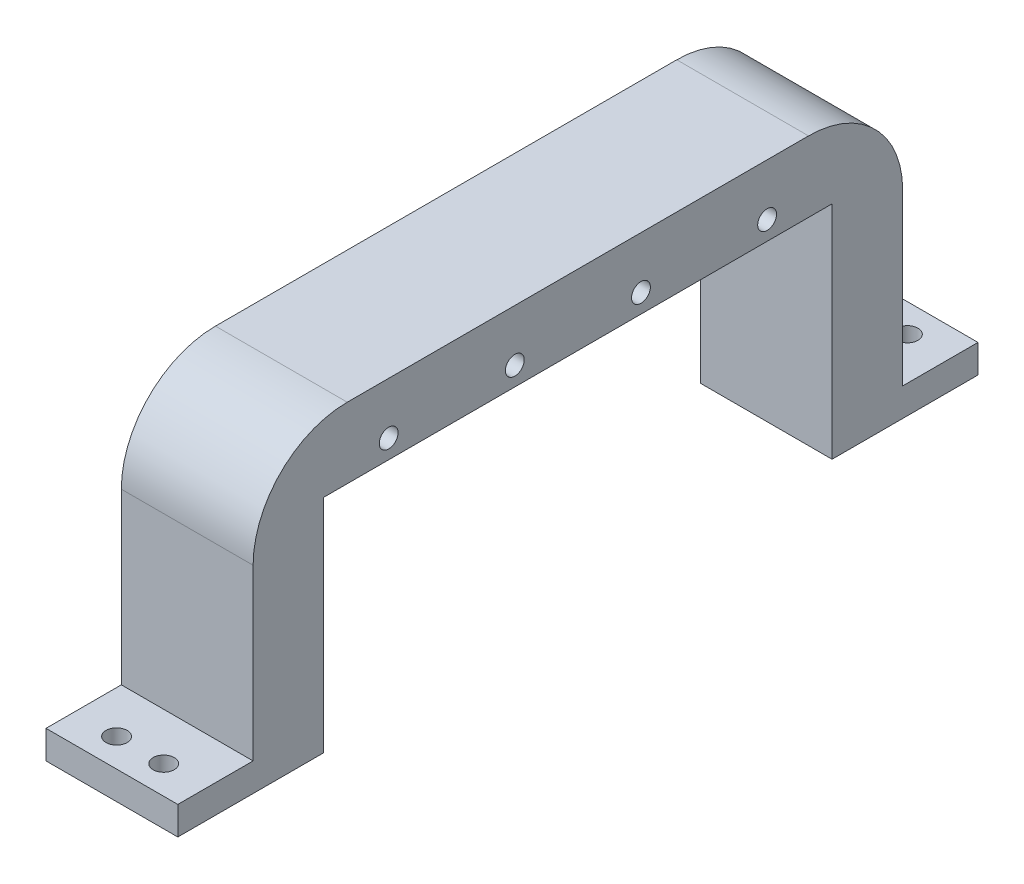
ISO-10303-21;
HEADER;
FILE_DESCRIPTION(('STEP AP214'),'2;1');
FILE_NAME('part.step','',(''),(''),'','','');
FILE_SCHEMA(('AUTOMOTIVE_DESIGN { 1 0 10303 214 1 1 1 1 }'));
ENDSEC;
DATA;
#1=APPLICATION_CONTEXT('core data for automotive mechanical design processes');
#2=APPLICATION_PROTOCOL_DEFINITION('international standard','automotive_design',2000,#1);
#3=PRODUCT_CONTEXT('',#1,'mechanical');
#4=PRODUCT('Part','Part','',(#3));
#5=PRODUCT_RELATED_PRODUCT_CATEGORY('part','',(#4));
#6=PRODUCT_DEFINITION_FORMATION('','',#4);
#7=PRODUCT_DEFINITION_CONTEXT('part definition',#1,'design');
#8=PRODUCT_DEFINITION('design','',#6,#7);
#9=PRODUCT_DEFINITION_SHAPE('','',#8);
#10=(LENGTH_UNIT() NAMED_UNIT(*) SI_UNIT(.MILLI.,.METRE.));
#11=(NAMED_UNIT(*) PLANE_ANGLE_UNIT() SI_UNIT($,.RADIAN.));
#12=(NAMED_UNIT(*) SI_UNIT($,.STERADIAN.) SOLID_ANGLE_UNIT());
#13=UNCERTAINTY_MEASURE_WITH_UNIT(LENGTH_MEASURE(1.E-05),#10,'distance_accuracy_value','');
#14=(GEOMETRIC_REPRESENTATION_CONTEXT(3) GLOBAL_UNCERTAINTY_ASSIGNED_CONTEXT((#13)) GLOBAL_UNIT_ASSIGNED_CONTEXT((#10,
#11,#12)) REPRESENTATION_CONTEXT('',''));
#15=CARTESIAN_POINT('',(0.,0.,0.));
#16=DIRECTION('',(0.,0.,1.));
#17=DIRECTION('',(1.,0.,0.));
#18=AXIS2_PLACEMENT_3D('',#15,#16,#17);
#19=CARTESIAN_POINT('',(-7.,0.,-27.));
#20=DIRECTION('',(0.,0.,1.));
#21=DIRECTION('',(0.,-1.,0.));
#22=AXIS2_PLACEMENT_3D('',#19,#20,#21);
#23=PLANE('',#22);
#24=DIRECTION('',(1.,0.,0.));
#25=VECTOR('',#24,1.);
#26=CARTESIAN_POINT('',(-7.,-23.5,-27.));
#27=LINE('',#26,#25);
#28=CARTESIAN_POINT('',(-7.,-23.5,-27.));
#29=VERTEX_POINT('',#28);
#30=CARTESIAN_POINT('',(7.,-23.5,-27.));
#31=VERTEX_POINT('',#30);
#32=EDGE_CURVE('E191',#29,#31,#27,.T.);
#33=ORIENTED_EDGE('',*,*,#32,.T.);
#34=DIRECTION('',(0.,-1.,0.));
#35=VECTOR('',#34,1.);
#36=CARTESIAN_POINT('',(7.,0.,-27.));
#37=LINE('',#36,#35);
#38=CARTESIAN_POINT('',(7.,0.,-27.));
#39=VERTEX_POINT('',#38);
#40=EDGE_CURVE('E364',#39,#31,#37,.T.);
#41=ORIENTED_EDGE('',*,*,#40,.F.);
#42=DIRECTION('',(1.,0.,0.));
#43=VECTOR('',#42,1.);
#44=CARTESIAN_POINT('',(-7.,0.,-27.));
#45=LINE('',#44,#43);
#46=CARTESIAN_POINT('',(-7.,0.,-27.));
#47=VERTEX_POINT('',#46);
#48=EDGE_CURVE('E192',#47,#39,#45,.T.);
#49=ORIENTED_EDGE('',*,*,#48,.F.);
#50=DIRECTION('',(0.,-1.,0.));
#51=VECTOR('',#50,1.);
#52=CARTESIAN_POINT('',(-7.,0.,-27.));
#53=LINE('',#52,#51);
#54=EDGE_CURVE('E172',#47,#29,#53,.T.);
#55=ORIENTED_EDGE('',*,*,#54,.T.);
#56=EDGE_LOOP('',(#33,#41,#49,#55));
#57=FACE_BOUND('',#56,.T.);
#58=ADVANCED_FACE('F39',(#57),#23,.T.);
#59=CARTESIAN_POINT('',(-7.,0.,27.));
#60=DIRECTION('',(0.,-1.,0.));
#61=DIRECTION('',(0.,0.,-1.));
#62=AXIS2_PLACEMENT_3D('',#59,#60,#61);
#63=PLANE('',#62);
#64=ORIENTED_EDGE('',*,*,#48,.T.);
#65=DIRECTION('',(0.,0.,-1.));
#66=VECTOR('',#65,1.);
#67=CARTESIAN_POINT('',(7.,0.,27.));
#68=LINE('',#67,#66);
#69=CARTESIAN_POINT('',(7.,0.,27.));
#70=VERTEX_POINT('',#69);
#71=EDGE_CURVE('E256',#70,#39,#68,.T.);
#72=ORIENTED_EDGE('',*,*,#71,.F.);
#73=DIRECTION('',(1.,0.,0.));
#74=VECTOR('',#73,1.);
#75=CARTESIAN_POINT('',(-7.,0.,27.));
#76=LINE('',#75,#74);
#77=CARTESIAN_POINT('',(-7.,0.,27.));
#78=VERTEX_POINT('',#77);
#79=EDGE_CURVE('E196',#78,#70,#76,.T.);
#80=ORIENTED_EDGE('',*,*,#79,.F.);
#81=DIRECTION('',(0.,0.,-1.));
#82=VECTOR('',#81,1.);
#83=CARTESIAN_POINT('',(-7.,0.,27.));
#84=LINE('',#83,#82);
#85=EDGE_CURVE('E187',#78,#47,#84,.T.);
#86=ORIENTED_EDGE('',*,*,#85,.T.);
#87=EDGE_LOOP('',(#64,#72,#80,#86));
#88=FACE_BOUND('',#87,.T.);
#89=ADVANCED_FACE('F269',(#88),#63,.T.);
#90=CARTESIAN_POINT('',(-7.,0.,27.));
#91=DIRECTION('',(0.,0.,-1.));
#92=DIRECTION('',(0.,1.,0.));
#93=AXIS2_PLACEMENT_3D('',#90,#91,#92);
#94=PLANE('',#93);
#95=ORIENTED_EDGE('',*,*,#79,.T.);
#96=DIRECTION('',(0.,1.,0.));
#97=VECTOR('',#96,1.);
#98=CARTESIAN_POINT('',(7.,0.,27.));
#99=LINE('',#98,#97);
#100=CARTESIAN_POINT('',(7.,-23.5,27.));
#101=VERTEX_POINT('',#100);
#102=EDGE_CURVE('E248',#101,#70,#99,.T.);
#103=ORIENTED_EDGE('',*,*,#102,.F.);
#104=DIRECTION('',(1.,0.,0.));
#105=VECTOR('',#104,1.);
#106=CARTESIAN_POINT('',(-7.,-23.5,27.));
#107=LINE('',#106,#105);
#108=CARTESIAN_POINT('',(-7.,-23.5,27.));
#109=VERTEX_POINT('',#108);
#110=EDGE_CURVE('E199',#109,#101,#107,.T.);
#111=ORIENTED_EDGE('',*,*,#110,.F.);
#112=DIRECTION('',(0.,1.,0.));
#113=VECTOR('',#112,1.);
#114=CARTESIAN_POINT('',(-7.,0.,27.));
#115=LINE('',#114,#113);
#116=EDGE_CURVE('E183',#109,#78,#115,.T.);
#117=ORIENTED_EDGE('',*,*,#116,.T.);
#118=EDGE_LOOP('',(#95,#103,#111,#117));
#119=FACE_BOUND('',#118,.T.);
#120=ADVANCED_FACE('F273',(#119),#94,.T.);
#121=CARTESIAN_POINT('',(-7.,-23.5,27.));
#122=DIRECTION('',(0.,-1.,0.));
#123=DIRECTION('',(0.,0.,-1.));
#124=AXIS2_PLACEMENT_3D('',#121,#122,#123);
#125=PLANE('',#124);
#126=CARTESIAN_POINT('',(-2.5,-23.5,30.75));
#127=DIRECTION('',(0.,-1.,0.));
#128=DIRECTION('',(0.,0.,1.));
#129=AXIS2_PLACEMENT_3D('',#126,#127,#128);
#130=CIRCLE('',#129,1.);
#131=CARTESIAN_POINT('',(-2.5,-23.5,31.75));
#132=VERTEX_POINT('',#131);
#133=EDGE_CURVE('E308',#132,#132,#130,.T.);
#134=ORIENTED_EDGE('',*,*,#133,.F.);
#135=EDGE_LOOP('',(#134));
#136=FACE_BOUND('',#135,.T.);
#137=CARTESIAN_POINT('',(2.5,-23.5,30.75));
#138=DIRECTION('',(0.,-1.,0.));
#139=DIRECTION('',(0.,0.,-1.));
#140=AXIS2_PLACEMENT_3D('',#137,#138,#139);
#141=CIRCLE('',#140,1.);
#142=CARTESIAN_POINT('',(2.5,-23.5,29.75));
#143=VERTEX_POINT('',#142);
#144=EDGE_CURVE('E300',#143,#143,#141,.T.);
#145=ORIENTED_EDGE('',*,*,#144,.F.);
#146=EDGE_LOOP('',(#145));
#147=FACE_BOUND('',#146,.T.);
#148=ORIENTED_EDGE('',*,*,#110,.T.);
#149=DIRECTION('',(0.,0.,-1.));
#150=VECTOR('',#149,1.);
#151=CARTESIAN_POINT('',(7.,-23.5,27.));
#152=LINE('',#151,#150);
#153=CARTESIAN_POINT('',(7.,-23.5,42.5));
#154=VERTEX_POINT('',#153);
#155=EDGE_CURVE('E243',#154,#101,#152,.T.);
#156=ORIENTED_EDGE('',*,*,#155,.F.);
#157=DIRECTION('',(-1.,0.,0.));
#158=VECTOR('',#157,1.);
#159=CARTESIAN_POINT('',(-7.,-23.5,42.5));
#160=LINE('',#159,#158);
#161=CARTESIAN_POINT('',(-7.,-23.5,42.5));
#162=VERTEX_POINT('',#161);
#163=EDGE_CURVE('E280',#154,#162,#160,.T.);
#164=ORIENTED_EDGE('',*,*,#163,.T.);
#165=DIRECTION('',(0.,0.,-1.));
#166=VECTOR('',#165,1.);
#167=CARTESIAN_POINT('',(-7.,-23.5,27.));
#168=LINE('',#167,#166);
#169=EDGE_CURVE('E179',#162,#109,#168,.T.);
#170=ORIENTED_EDGE('',*,*,#169,.T.);
#171=EDGE_LOOP('',(#148,#156,#164,#170));
#172=FACE_BOUND('',#171,.T.);
#173=CARTESIAN_POINT('',(2.5,-23.5,39.5));
#174=DIRECTION('',(0.,-1.,0.));
#175=DIRECTION('',(0.,0.,1.));
#176=AXIS2_PLACEMENT_3D('',#173,#174,#175);
#177=CIRCLE('',#176,1.12291817378319);
#178=CARTESIAN_POINT('',(2.5,-23.5,40.6229181737832));
#179=VERTEX_POINT('',#178);
#180=EDGE_CURVE('E520',#179,#179,#177,.T.);
#181=ORIENTED_EDGE('',*,*,#180,.F.);
#182=EDGE_LOOP('',(#181));
#183=FACE_BOUND('',#182,.T.);
#184=CARTESIAN_POINT('',(-2.5,-23.5,39.5));
#185=DIRECTION('',(0.,-1.,0.));
#186=DIRECTION('',(0.,0.,-1.));
#187=AXIS2_PLACEMENT_3D('',#184,#185,#186);
#188=CIRCLE('',#187,1.12291817378319);
#189=CARTESIAN_POINT('',(-2.5,-23.5,38.3770818262168));
#190=VERTEX_POINT('',#189);
#191=EDGE_CURVE('E291',#190,#190,#188,.T.);
#192=ORIENTED_EDGE('',*,*,#191,.F.);
#193=EDGE_LOOP('',(#192));
#194=FACE_BOUND('',#193,.T.);
#195=ADVANCED_FACE('F277',(#136,#147,#172,#183,#194),#125,.T.);
#196=CARTESIAN_POINT('',(-7.,-23.5,34.5));
#197=DIRECTION('',(0.,0.,1.));
#198=DIRECTION('',(1.,0.,0.));
#199=AXIS2_PLACEMENT_3D('',#196,#197,#198);
#200=PLANE('',#199);
#201=DIRECTION('',(1.,0.,0.));
#202=VECTOR('',#201,1.);
#203=CARTESIAN_POINT('',(-7.,-20.5,34.5));
#204=LINE('',#203,#202);
#205=CARTESIAN_POINT('',(-7.,-20.5,34.5));
#206=VERTEX_POINT('',#205);
#207=CARTESIAN_POINT('',(7.,-20.5,34.5));
#208=VERTEX_POINT('',#207);
#209=EDGE_CURVE('E241',#206,#208,#204,.T.);
#210=ORIENTED_EDGE('',*,*,#209,.T.);
#211=DIRECTION('',(0.,-1.,0.));
#212=VECTOR('',#211,1.);
#213=CARTESIAN_POINT('',(7.,-23.5,34.5));
#214=LINE('',#213,#212);
#215=CARTESIAN_POINT('',(7.,-2.50000000000001,34.5));
#216=VERTEX_POINT('',#215);
#217=EDGE_CURVE('E236',#216,#208,#214,.T.);
#218=ORIENTED_EDGE('',*,*,#217,.F.);
#219=DIRECTION('',(1.,0.,0.));
#220=VECTOR('',#219,1.);
#221=CARTESIAN_POINT('',(-7.,-2.50000000000001,34.5));
#222=LINE('',#221,#220);
#223=CARTESIAN_POINT('',(-7.,-2.50000000000001,34.5));
#224=VERTEX_POINT('',#223);
#225=EDGE_CURVE('E216',#216,#224,#222,.F.);
#226=ORIENTED_EDGE('',*,*,#225,.T.);
#227=DIRECTION('',(0.,-1.,0.));
#228=VECTOR('',#227,1.);
#229=CARTESIAN_POINT('',(-7.,-23.5,34.5));
#230=LINE('',#229,#228);
#231=EDGE_CURVE('E170',#224,#206,#230,.T.);
#232=ORIENTED_EDGE('',*,*,#231,.T.);
#233=EDGE_LOOP('',(#210,#218,#226,#232));
#234=FACE_BOUND('',#233,.T.);
#235=ADVANCED_FACE('F240',(#234),#200,.T.);
#236=CARTESIAN_POINT('',(-7.,7.49999999999999,-34.5));
#237=DIRECTION('',(0.,1.,0.));
#238=DIRECTION('',(0.,0.,1.));
#239=AXIS2_PLACEMENT_3D('',#236,#237,#238);
#240=PLANE('',#239);
#241=DIRECTION('',(0.,0.,1.));
#242=VECTOR('',#241,1.);
#243=CARTESIAN_POINT('',(-7.,7.49999999999999,-34.5));
#244=LINE('',#243,#242);
#245=CARTESIAN_POINT('',(-7.,7.49999999999999,-24.5));
#246=VERTEX_POINT('',#245);
#247=CARTESIAN_POINT('',(-7.,7.49999999999999,24.5));
#248=VERTEX_POINT('',#247);
#249=EDGE_CURVE('E164',#246,#248,#244,.T.);
#250=ORIENTED_EDGE('',*,*,#249,.T.);
#251=DIRECTION('',(1.,0.,0.));
#252=VECTOR('',#251,1.);
#253=CARTESIAN_POINT('',(-7.,7.49999999999999,24.5));
#254=LINE('',#253,#252);
#255=CARTESIAN_POINT('',(7.,7.49999999999999,24.5));
#256=VERTEX_POINT('',#255);
#257=EDGE_CURVE('E206',#248,#256,#254,.T.);
#258=ORIENTED_EDGE('',*,*,#257,.T.);
#259=DIRECTION('',(0.,0.,1.));
#260=VECTOR('',#259,1.);
#261=CARTESIAN_POINT('',(7.,7.49999999999999,-34.5));
#262=LINE('',#261,#260);
#263=CARTESIAN_POINT('',(7.,7.49999999999999,-24.5));
#264=VERTEX_POINT('',#263);
#265=EDGE_CURVE('E237',#264,#256,#262,.T.);
#266=ORIENTED_EDGE('',*,*,#265,.F.);
#267=DIRECTION('',(1.,0.,0.));
#268=VECTOR('',#267,1.);
#269=CARTESIAN_POINT('',(-7.,7.49999999999999,-24.5));
#270=LINE('',#269,#268);
#271=EDGE_CURVE('E195',#264,#246,#270,.F.);
#272=ORIENTED_EDGE('',*,*,#271,.T.);
#273=EDGE_LOOP('',(#250,#258,#266,#272));
#274=FACE_BOUND('',#273,.T.);
#275=ADVANCED_FACE('F227',(#274),#240,.T.);
#276=CARTESIAN_POINT('',(-7.,-23.5,-34.5));
#277=DIRECTION('',(0.,0.,-1.));
#278=DIRECTION('',(-1.,0.,0.));
#279=AXIS2_PLACEMENT_3D('',#276,#277,#278);
#280=PLANE('',#279);
#281=DIRECTION('',(-1.,0.,0.));
#282=VECTOR('',#281,1.);
#283=CARTESIAN_POINT('',(-7.,-20.5,-34.5));
#284=LINE('',#283,#282);
#285=CARTESIAN_POINT('',(7.,-20.5,-34.5));
#286=VERTEX_POINT('',#285);
#287=CARTESIAN_POINT('',(-7.,-20.5,-34.5));
#288=VERTEX_POINT('',#287);
#289=EDGE_CURVE('E144',#286,#288,#284,.T.);
#290=ORIENTED_EDGE('',*,*,#289,.T.);
#291=DIRECTION('',(0.,1.,0.));
#292=VECTOR('',#291,1.);
#293=CARTESIAN_POINT('',(-7.,-23.5,-34.5));
#294=LINE('',#293,#292);
#295=CARTESIAN_POINT('',(-7.,-2.50000000000001,-34.5));
#296=VERTEX_POINT('',#295);
#297=EDGE_CURVE('E62',#288,#296,#294,.T.);
#298=ORIENTED_EDGE('',*,*,#297,.T.);
#299=DIRECTION('',(1.,0.,0.));
#300=VECTOR('',#299,1.);
#301=CARTESIAN_POINT('',(-7.,-2.50000000000001,-34.5));
#302=LINE('',#301,#300);
#303=CARTESIAN_POINT('',(7.,-2.50000000000001,-34.5));
#304=VERTEX_POINT('',#303);
#305=EDGE_CURVE('E11',#296,#304,#302,.T.);
#306=ORIENTED_EDGE('',*,*,#305,.T.);
#307=DIRECTION('',(0.,1.,0.));
#308=VECTOR('',#307,1.);
#309=CARTESIAN_POINT('',(7.,-23.5,-34.5));
#310=LINE('',#309,#308);
#311=EDGE_CURVE('E153',#286,#304,#310,.T.);
#312=ORIENTED_EDGE('',*,*,#311,.F.);
#313=EDGE_LOOP('',(#290,#298,#306,#312));
#314=FACE_BOUND('',#313,.T.);
#315=ADVANCED_FACE('F152',(#314),#280,.T.);
#316=CARTESIAN_POINT('',(-7.,-23.5,-27.));
#317=DIRECTION('',(0.,-1.,0.));
#318=DIRECTION('',(0.,0.,-1.));
#319=AXIS2_PLACEMENT_3D('',#316,#317,#318);
#320=PLANE('',#319);
#321=CARTESIAN_POINT('',(2.5,-23.5,-30.75));
#322=DIRECTION('',(0.,-1.,0.));
#323=DIRECTION('',(0.,0.,1.));
#324=AXIS2_PLACEMENT_3D('',#321,#322,#323);
#325=CIRCLE('',#324,1.);
#326=CARTESIAN_POINT('',(2.5,-23.5,-29.75));
#327=VERTEX_POINT('',#326);
#328=EDGE_CURVE('E317',#327,#327,#325,.T.);
#329=ORIENTED_EDGE('',*,*,#328,.F.);
#330=EDGE_LOOP('',(#329));
#331=FACE_BOUND('',#330,.T.);
#332=CARTESIAN_POINT('',(-2.5,-23.5,-30.75));
#333=DIRECTION('',(0.,-1.,0.));
#334=DIRECTION('',(0.,0.,-1.));
#335=AXIS2_PLACEMENT_3D('',#332,#333,#334);
#336=CIRCLE('',#335,1.);
#337=CARTESIAN_POINT('',(-2.5,-23.5,-31.75));
#338=VERTEX_POINT('',#337);
#339=EDGE_CURVE('E316',#338,#338,#336,.T.);
#340=ORIENTED_EDGE('',*,*,#339,.F.);
#341=EDGE_LOOP('',(#340));
#342=FACE_BOUND('',#341,.T.);
#343=DIRECTION('',(0.,0.,-1.));
#344=VECTOR('',#343,1.);
#345=CARTESIAN_POINT('',(-7.,-23.5,-27.));
#346=LINE('',#345,#344);
#347=CARTESIAN_POINT('',(-7.,-23.5,-42.5));
#348=VERTEX_POINT('',#347);
#349=EDGE_CURVE('E165',#29,#348,#346,.T.);
#350=ORIENTED_EDGE('',*,*,#349,.T.);
#351=DIRECTION('',(1.,0.,0.));
#352=VECTOR('',#351,1.);
#353=CARTESIAN_POINT('',(-7.,-23.5,-42.5));
#354=LINE('',#353,#352);
#355=CARTESIAN_POINT('',(7.,-23.5,-42.5));
#356=VERTEX_POINT('',#355);
#357=EDGE_CURVE('E155',#348,#356,#354,.T.);
#358=ORIENTED_EDGE('',*,*,#357,.T.);
#359=DIRECTION('',(0.,0.,-1.));
#360=VECTOR('',#359,1.);
#361=CARTESIAN_POINT('',(7.,-23.5,-27.));
#362=LINE('',#361,#360);
#363=EDGE_CURVE('E371',#31,#356,#362,.T.);
#364=ORIENTED_EDGE('',*,*,#363,.F.);
#365=ORIENTED_EDGE('',*,*,#32,.F.);
#366=EDGE_LOOP('',(#350,#358,#364,#365));
#367=FACE_BOUND('',#366,.T.);
#368=CARTESIAN_POINT('',(-2.5,-23.5,-39.5));
#369=DIRECTION('',(0.,-1.,0.));
#370=DIRECTION('',(0.,0.,1.));
#371=AXIS2_PLACEMENT_3D('',#368,#369,#370);
#372=CIRCLE('',#371,1.12291817378319);
#373=CARTESIAN_POINT('',(-2.5,-23.5,-38.3770818262168));
#374=VERTEX_POINT('',#373);
#375=EDGE_CURVE('E493',#374,#374,#372,.T.);
#376=ORIENTED_EDGE('',*,*,#375,.F.);
#377=EDGE_LOOP('',(#376));
#378=FACE_BOUND('',#377,.T.);
#379=CARTESIAN_POINT('',(2.5,-23.5,-39.5));
#380=DIRECTION('',(0.,-1.,0.));
#381=DIRECTION('',(0.,0.,-1.));
#382=AXIS2_PLACEMENT_3D('',#379,#380,#381);
#383=CIRCLE('',#382,1.12291817378319);
#384=CARTESIAN_POINT('',(2.5,-23.5,-40.6229181737832));
#385=VERTEX_POINT('',#384);
#386=EDGE_CURVE('E498',#385,#385,#383,.T.);
#387=ORIENTED_EDGE('',*,*,#386,.F.);
#388=EDGE_LOOP('',(#387));
#389=FACE_BOUND('',#388,.T.);
#390=ADVANCED_FACE('F392',(#331,#342,#367,#378,#389),#320,.T.);
#391=CARTESIAN_POINT('',(-7.,0.,0.));
#392=DIRECTION('',(1.,0.,0.));
#393=DIRECTION('',(0.,0.,-1.));
#394=AXIS2_PLACEMENT_3D('',#391,#392,#393);
#395=PLANE('',#394);
#396=CARTESIAN_POINT('',(-7.,2.,20.1));
#397=DIRECTION('',(1.,0.,0.));
#398=DIRECTION('',(0.,0.,-1.));
#399=AXIS2_PLACEMENT_3D('',#396,#397,#398);
#400=CIRCLE('',#399,1.);
#401=CARTESIAN_POINT('',(-7.,2.,19.1));
#402=VERTEX_POINT('',#401);
#403=EDGE_CURVE('E344',#402,#402,#400,.T.);
#404=ORIENTED_EDGE('',*,*,#403,.T.);
#405=EDGE_LOOP('',(#404));
#406=FACE_BOUND('',#405,.T.);
#407=CARTESIAN_POINT('',(-7.,2.,-20.1));
#408=DIRECTION('',(1.,0.,0.));
#409=DIRECTION('',(0.,0.,1.));
#410=AXIS2_PLACEMENT_3D('',#407,#408,#409);
#411=CIRCLE('',#410,1.);
#412=CARTESIAN_POINT('',(-7.,2.,-19.1));
#413=VERTEX_POINT('',#412);
#414=EDGE_CURVE('E353',#413,#413,#411,.T.);
#415=ORIENTED_EDGE('',*,*,#414,.T.);
#416=EDGE_LOOP('',(#415));
#417=FACE_BOUND('',#416,.T.);
#418=CARTESIAN_POINT('',(-7.,2.,-6.7));
#419=DIRECTION('',(1.,0.,0.));
#420=DIRECTION('',(0.,0.,1.));
#421=AXIS2_PLACEMENT_3D('',#418,#419,#420);
#422=CIRCLE('',#421,1.);
#423=CARTESIAN_POINT('',(-7.,2.,-5.7));
#424=VERTEX_POINT('',#423);
#425=EDGE_CURVE('E336',#424,#424,#422,.T.);
#426=ORIENTED_EDGE('',*,*,#425,.T.);
#427=EDGE_LOOP('',(#426));
#428=FACE_BOUND('',#427,.T.);
#429=CARTESIAN_POINT('',(-7.,2.,6.7));
#430=DIRECTION('',(1.,0.,0.));
#431=DIRECTION('',(0.,0.,-1.));
#432=AXIS2_PLACEMENT_3D('',#429,#430,#431);
#433=CIRCLE('',#432,1.);
#434=CARTESIAN_POINT('',(-7.,2.,5.7));
#435=VERTEX_POINT('',#434);
#436=EDGE_CURVE('E360',#435,#435,#433,.T.);
#437=ORIENTED_EDGE('',*,*,#436,.T.);
#438=EDGE_LOOP('',(#437));
#439=FACE_BOUND('',#438,.T.);
#440=ORIENTED_EDGE('',*,*,#231,.F.);
#441=CARTESIAN_POINT('',(-7.,-2.50000000000001,24.5));
#442=DIRECTION('',(1.,0.,0.));
#443=DIRECTION('',(0.,0.,-1.));
#444=AXIS2_PLACEMENT_3D('',#441,#442,#443);
#445=CIRCLE('',#444,10.);
#446=EDGE_CURVE('E48',#224,#248,#445,.F.);
#447=ORIENTED_EDGE('',*,*,#446,.T.);
#448=ORIENTED_EDGE('',*,*,#249,.F.);
#449=CARTESIAN_POINT('',(-7.,-2.50000000000001,-24.5));
#450=DIRECTION('',(1.,0.,0.));
#451=DIRECTION('',(0.,0.,-1.));
#452=AXIS2_PLACEMENT_3D('',#449,#450,#451);
#453=CIRCLE('',#452,10.);
#454=EDGE_CURVE('E161',#246,#296,#453,.F.);
#455=ORIENTED_EDGE('',*,*,#454,.T.);
#456=ORIENTED_EDGE('',*,*,#297,.F.);
#457=DIRECTION('',(0.,0.,-1.));
#458=VECTOR('',#457,1.);
#459=CARTESIAN_POINT('',(-7.,-20.5,-34.5));
#460=LINE('',#459,#458);
#461=CARTESIAN_POINT('',(-7.,-20.5,-42.5));
#462=VERTEX_POINT('',#461);
#463=EDGE_CURVE('E142',#288,#462,#460,.T.);
#464=ORIENTED_EDGE('',*,*,#463,.T.);
#465=DIRECTION('',(0.,-1.,0.));
#466=VECTOR('',#465,1.);
#467=CARTESIAN_POINT('',(-7.,-20.5,-42.5));
#468=LINE('',#467,#466);
#469=EDGE_CURVE('E512',#462,#348,#468,.T.);
#470=ORIENTED_EDGE('',*,*,#469,.T.);
#471=ORIENTED_EDGE('',*,*,#349,.F.);
#472=ORIENTED_EDGE('',*,*,#54,.F.);
#473=ORIENTED_EDGE('',*,*,#85,.F.);
#474=ORIENTED_EDGE('',*,*,#116,.F.);
#475=ORIENTED_EDGE('',*,*,#169,.F.);
#476=DIRECTION('',(0.,-1.,0.));
#477=VECTOR('',#476,1.);
#478=CARTESIAN_POINT('',(-7.,-20.5,42.5));
#479=LINE('',#478,#477);
#480=CARTESIAN_POINT('',(-7.,-20.5,42.5));
#481=VERTEX_POINT('',#480);
#482=EDGE_CURVE('E297',#481,#162,#479,.T.);
#483=ORIENTED_EDGE('',*,*,#482,.F.);
#484=DIRECTION('',(0.,0.,-1.));
#485=VECTOR('',#484,1.);
#486=CARTESIAN_POINT('',(-7.,-20.5,34.5));
#487=LINE('',#486,#485);
#488=EDGE_CURVE('E284',#481,#206,#487,.T.);
#489=ORIENTED_EDGE('',*,*,#488,.T.);
#490=EDGE_LOOP('',(#440,#447,#448,#455,#456,#464,#470,#471,#472,#473,#474,#475,#483,#489));
#491=FACE_BOUND('',#490,.T.);
#492=ADVANCED_FACE('F158',(#406,#417,#428,#439,#491),#395,.F.);
#493=CARTESIAN_POINT('',(7.,0.,0.));
#494=DIRECTION('',(1.,0.,0.));
#495=DIRECTION('',(0.,0.,-1.));
#496=AXIS2_PLACEMENT_3D('',#493,#494,#495);
#497=PLANE('',#496);
#498=CARTESIAN_POINT('',(7.,2.,20.1));
#499=DIRECTION('',(1.,0.,0.));
#500=DIRECTION('',(0.,0.,-1.));
#501=AXIS2_PLACEMENT_3D('',#498,#499,#500);
#502=CIRCLE('',#501,1.);
#503=CARTESIAN_POINT('',(7.,2.,19.1));
#504=VERTEX_POINT('',#503);
#505=EDGE_CURVE('E349',#504,#504,#502,.T.);
#506=ORIENTED_EDGE('',*,*,#505,.F.);
#507=EDGE_LOOP('',(#506));
#508=FACE_BOUND('',#507,.T.);
#509=CARTESIAN_POINT('',(7.,2.,-20.1));
#510=DIRECTION('',(1.,0.,0.));
#511=DIRECTION('',(0.,0.,1.));
#512=AXIS2_PLACEMENT_3D('',#509,#510,#511);
#513=CIRCLE('',#512,1.);
#514=CARTESIAN_POINT('',(7.,2.,-19.1));
#515=VERTEX_POINT('',#514);
#516=EDGE_CURVE('E340',#515,#515,#513,.T.);
#517=ORIENTED_EDGE('',*,*,#516,.F.);
#518=EDGE_LOOP('',(#517));
#519=FACE_BOUND('',#518,.T.);
#520=CARTESIAN_POINT('',(7.,2.,-6.7));
#521=DIRECTION('',(1.,0.,0.));
#522=DIRECTION('',(0.,0.,1.));
#523=AXIS2_PLACEMENT_3D('',#520,#521,#522);
#524=CIRCLE('',#523,1.);
#525=CARTESIAN_POINT('',(7.,2.,-5.7));
#526=VERTEX_POINT('',#525);
#527=EDGE_CURVE('E332',#526,#526,#524,.T.);
#528=ORIENTED_EDGE('',*,*,#527,.F.);
#529=EDGE_LOOP('',(#528));
#530=FACE_BOUND('',#529,.T.);
#531=CARTESIAN_POINT('',(7.,2.,6.7));
#532=DIRECTION('',(1.,0.,0.));
#533=DIRECTION('',(0.,0.,-1.));
#534=AXIS2_PLACEMENT_3D('',#531,#532,#533);
#535=CIRCLE('',#534,1.);
#536=CARTESIAN_POINT('',(7.,2.,5.7));
#537=VERTEX_POINT('',#536);
#538=EDGE_CURVE('E348',#537,#537,#535,.T.);
#539=ORIENTED_EDGE('',*,*,#538,.F.);
#540=EDGE_LOOP('',(#539));
#541=FACE_BOUND('',#540,.T.);
#542=ORIENTED_EDGE('',*,*,#265,.T.);
#543=CARTESIAN_POINT('',(7.,-2.50000000000001,24.5));
#544=DIRECTION('',(1.,0.,0.));
#545=DIRECTION('',(0.,0.,-1.));
#546=AXIS2_PLACEMENT_3D('',#543,#544,#545);
#547=CIRCLE('',#546,10.);
#548=EDGE_CURVE('E213',#256,#216,#547,.T.);
#549=ORIENTED_EDGE('',*,*,#548,.T.);
#550=ORIENTED_EDGE('',*,*,#217,.T.);
#551=DIRECTION('',(0.,0.,1.));
#552=VECTOR('',#551,1.);
#553=CARTESIAN_POINT('',(7.,-20.5,34.5));
#554=LINE('',#553,#552);
#555=CARTESIAN_POINT('',(7.,-20.5,42.5));
#556=VERTEX_POINT('',#555);
#557=EDGE_CURVE('E534',#208,#556,#554,.T.);
#558=ORIENTED_EDGE('',*,*,#557,.T.);
#559=DIRECTION('',(0.,-1.,0.));
#560=VECTOR('',#559,1.);
#561=CARTESIAN_POINT('',(7.,-20.5,42.5));
#562=LINE('',#561,#560);
#563=EDGE_CURVE('E301',#556,#154,#562,.T.);
#564=ORIENTED_EDGE('',*,*,#563,.T.);
#565=ORIENTED_EDGE('',*,*,#155,.T.);
#566=ORIENTED_EDGE('',*,*,#102,.T.);
#567=ORIENTED_EDGE('',*,*,#71,.T.);
#568=ORIENTED_EDGE('',*,*,#40,.T.);
#569=ORIENTED_EDGE('',*,*,#363,.T.);
#570=DIRECTION('',(0.,-1.,0.));
#571=VECTOR('',#570,1.);
#572=CARTESIAN_POINT('',(7.,-20.5,-42.5));
#573=LINE('',#572,#571);
#574=CARTESIAN_POINT('',(7.,-20.5,-42.5));
#575=VERTEX_POINT('',#574);
#576=EDGE_CURVE('E516',#575,#356,#573,.T.);
#577=ORIENTED_EDGE('',*,*,#576,.F.);
#578=DIRECTION('',(0.,0.,1.));
#579=VECTOR('',#578,1.);
#580=CARTESIAN_POINT('',(7.,-20.5,-34.5));
#581=LINE('',#580,#579);
#582=EDGE_CURVE('E55',#575,#286,#581,.T.);
#583=ORIENTED_EDGE('',*,*,#582,.T.);
#584=ORIENTED_EDGE('',*,*,#311,.T.);
#585=CARTESIAN_POINT('',(7.,-2.50000000000001,-24.5));
#586=DIRECTION('',(1.,0.,0.));
#587=DIRECTION('',(0.,0.,-1.));
#588=AXIS2_PLACEMENT_3D('',#585,#586,#587);
#589=CIRCLE('',#588,10.);
#590=EDGE_CURVE('E210',#304,#264,#589,.T.);
#591=ORIENTED_EDGE('',*,*,#590,.T.);
#592=EDGE_LOOP('',(#542,#549,#550,#558,#564,#565,#566,#567,#568,#569,#577,#583,#584,#591));
#593=FACE_BOUND('',#592,.T.);
#594=ADVANCED_FACE('F234',(#508,#519,#530,#541,#593),#497,.T.);
#595=CARTESIAN_POINT('',(-7.,-2.50000000000001,24.5));
#596=DIRECTION('',(1.,0.,0.));
#597=DIRECTION('',(0.,0.,-1.));
#598=AXIS2_PLACEMENT_3D('',#595,#596,#597);
#599=CYLINDRICAL_SURFACE('',#598,10.);
#600=ORIENTED_EDGE('',*,*,#446,.F.);
#601=ORIENTED_EDGE('',*,*,#225,.F.);
#602=ORIENTED_EDGE('',*,*,#548,.F.);
#603=ORIENTED_EDGE('',*,*,#257,.F.);
#604=EDGE_LOOP('',(#600,#601,#602,#603));
#605=FACE_BOUND('',#604,.T.);
#606=ADVANCED_FACE('F231',(#605),#599,.T.);
#607=CARTESIAN_POINT('',(-7.,-2.50000000000001,-24.5));
#608=DIRECTION('',(1.,0.,0.));
#609=DIRECTION('',(0.,0.,-1.));
#610=AXIS2_PLACEMENT_3D('',#607,#608,#609);
#611=CYLINDRICAL_SURFACE('',#610,10.);
#612=ORIENTED_EDGE('',*,*,#454,.F.);
#613=ORIENTED_EDGE('',*,*,#271,.F.);
#614=ORIENTED_EDGE('',*,*,#590,.F.);
#615=ORIENTED_EDGE('',*,*,#305,.F.);
#616=EDGE_LOOP('',(#612,#613,#614,#615));
#617=FACE_BOUND('',#616,.T.);
#618=ADVANCED_FACE('F41',(#617),#611,.T.);
#619=CARTESIAN_POINT('',(-7.,2.,6.7));
#620=DIRECTION('',(1.,0.,0.));
#621=DIRECTION('',(0.,0.,-1.));
#622=AXIS2_PLACEMENT_3D('',#619,#620,#621);
#623=CYLINDRICAL_SURFACE('',#622,1.);
#624=ORIENTED_EDGE('',*,*,#436,.F.);
#625=EDGE_LOOP('',(#624));
#626=FACE_BOUND('',#625,.T.);
#627=ORIENTED_EDGE('',*,*,#538,.T.);
#628=EDGE_LOOP('',(#627));
#629=FACE_BOUND('',#628,.T.);
#630=ADVANCED_FACE('F377',(#626,#629),#623,.F.);
#631=CARTESIAN_POINT('',(-7.,2.,-6.7));
#632=DIRECTION('',(1.,0.,0.));
#633=DIRECTION('',(0.,0.,-1.));
#634=AXIS2_PLACEMENT_3D('',#631,#632,#633);
#635=CYLINDRICAL_SURFACE('',#634,1.);
#636=ORIENTED_EDGE('',*,*,#425,.F.);
#637=EDGE_LOOP('',(#636));
#638=FACE_BOUND('',#637,.T.);
#639=ORIENTED_EDGE('',*,*,#527,.T.);
#640=EDGE_LOOP('',(#639));
#641=FACE_BOUND('',#640,.T.);
#642=ADVANCED_FACE('F382',(#638,#641),#635,.F.);
#643=CARTESIAN_POINT('',(-7.,2.,-20.1));
#644=DIRECTION('',(1.,0.,0.));
#645=DIRECTION('',(0.,0.,-1.));
#646=AXIS2_PLACEMENT_3D('',#643,#644,#645);
#647=CYLINDRICAL_SURFACE('',#646,1.);
#648=ORIENTED_EDGE('',*,*,#414,.F.);
#649=EDGE_LOOP('',(#648));
#650=FACE_BOUND('',#649,.T.);
#651=ORIENTED_EDGE('',*,*,#516,.T.);
#652=EDGE_LOOP('',(#651));
#653=FACE_BOUND('',#652,.T.);
#654=ADVANCED_FACE('F413',(#650,#653),#647,.F.);
#655=CARTESIAN_POINT('',(-7.,2.,20.1));
#656=DIRECTION('',(1.,0.,0.));
#657=DIRECTION('',(0.,0.,-1.));
#658=AXIS2_PLACEMENT_3D('',#655,#656,#657);
#659=CYLINDRICAL_SURFACE('',#658,1.);
#660=ORIENTED_EDGE('',*,*,#403,.F.);
#661=EDGE_LOOP('',(#660));
#662=FACE_BOUND('',#661,.T.);
#663=ORIENTED_EDGE('',*,*,#505,.T.);
#664=EDGE_LOOP('',(#663));
#665=FACE_BOUND('',#664,.T.);
#666=ADVANCED_FACE('F416',(#662,#665),#659,.F.);
#667=CARTESIAN_POINT('',(-2.5,-18.5,-30.75));
#668=DIRECTION('',(0.,-1.,0.));
#669=DIRECTION('',(0.,0.,-1.));
#670=AXIS2_PLACEMENT_3D('',#667,#668,#669);
#671=CYLINDRICAL_SURFACE('',#670,1.);
#672=CARTESIAN_POINT('',(-2.5,-18.5,-30.75));
#673=DIRECTION('',(0.,-1.,0.));
#674=DIRECTION('',(0.,0.,-1.));
#675=AXIS2_PLACEMENT_3D('',#672,#673,#674);
#676=CIRCLE('',#675,1.);
#677=CARTESIAN_POINT('',(-2.5,-18.5,-31.75));
#678=VERTEX_POINT('',#677);
#679=EDGE_CURVE('E328',#678,#678,#676,.T.);
#680=ORIENTED_EDGE('',*,*,#679,.F.);
#681=EDGE_LOOP('',(#680));
#682=FACE_BOUND('',#681,.T.);
#683=ORIENTED_EDGE('',*,*,#339,.T.);
#684=EDGE_LOOP('',(#683));
#685=FACE_BOUND('',#684,.T.);
#686=ADVANCED_FACE('F420',(#682,#685),#671,.F.);
#687=CARTESIAN_POINT('',(-2.5,-18.5,-30.75));
#688=DIRECTION('',(0.,-1.,0.));
#689=DIRECTION('',(0.,0.,-1.));
#690=AXIS2_PLACEMENT_3D('',#687,#688,#689);
#691=PLANE('',#690);
#692=ORIENTED_EDGE('',*,*,#679,.T.);
#693=EDGE_LOOP('',(#692));
#694=FACE_BOUND('',#693,.T.);
#695=ADVANCED_FACE('F427',(#694),#691,.T.);
#696=CARTESIAN_POINT('',(2.5,-18.5,-30.75));
#697=DIRECTION('',(0.,-1.,0.));
#698=DIRECTION('',(0.,0.,-1.));
#699=AXIS2_PLACEMENT_3D('',#696,#697,#698);
#700=CYLINDRICAL_SURFACE('',#699,1.);
#701=CARTESIAN_POINT('',(2.5,-18.5,-30.75));
#702=DIRECTION('',(0.,-1.,0.));
#703=DIRECTION('',(0.,0.,1.));
#704=AXIS2_PLACEMENT_3D('',#701,#702,#703);
#705=CIRCLE('',#704,1.);
#706=CARTESIAN_POINT('',(2.5,-18.5,-29.75));
#707=VERTEX_POINT('',#706);
#708=EDGE_CURVE('E312',#707,#707,#705,.T.);
#709=ORIENTED_EDGE('',*,*,#708,.F.);
#710=EDGE_LOOP('',(#709));
#711=FACE_BOUND('',#710,.T.);
#712=ORIENTED_EDGE('',*,*,#328,.T.);
#713=EDGE_LOOP('',(#712));
#714=FACE_BOUND('',#713,.T.);
#715=ADVANCED_FACE('F431',(#711,#714),#700,.F.);
#716=CARTESIAN_POINT('',(2.5,-18.5,-30.75));
#717=DIRECTION('',(0.,1.,0.));
#718=DIRECTION('',(0.,0.,1.));
#719=AXIS2_PLACEMENT_3D('',#716,#717,#718);
#720=PLANE('',#719);
#721=ORIENTED_EDGE('',*,*,#708,.T.);
#722=EDGE_LOOP('',(#721));
#723=FACE_BOUND('',#722,.T.);
#724=ADVANCED_FACE('F445',(#723),#720,.F.);
#725=CARTESIAN_POINT('',(2.5,-18.5,30.75));
#726=DIRECTION('',(0.,-1.,0.));
#727=DIRECTION('',(0.,0.,-1.));
#728=AXIS2_PLACEMENT_3D('',#725,#726,#727);
#729=CYLINDRICAL_SURFACE('',#728,1.);
#730=CARTESIAN_POINT('',(2.5,-18.5,30.75));
#731=DIRECTION('',(0.,-1.,0.));
#732=DIRECTION('',(0.,0.,-1.));
#733=AXIS2_PLACEMENT_3D('',#730,#731,#732);
#734=CIRCLE('',#733,1.);
#735=CARTESIAN_POINT('',(2.5,-18.5,29.75));
#736=VERTEX_POINT('',#735);
#737=EDGE_CURVE('E304',#736,#736,#734,.T.);
#738=ORIENTED_EDGE('',*,*,#737,.F.);
#739=EDGE_LOOP('',(#738));
#740=FACE_BOUND('',#739,.T.);
#741=ORIENTED_EDGE('',*,*,#144,.T.);
#742=EDGE_LOOP('',(#741));
#743=FACE_BOUND('',#742,.T.);
#744=ADVANCED_FACE('F449',(#740,#743),#729,.F.);
#745=CARTESIAN_POINT('',(2.5,-18.5,30.75));
#746=DIRECTION('',(0.,-1.,0.));
#747=DIRECTION('',(0.,0.,-1.));
#748=AXIS2_PLACEMENT_3D('',#745,#746,#747);
#749=PLANE('',#748);
#750=ORIENTED_EDGE('',*,*,#737,.T.);
#751=EDGE_LOOP('',(#750));
#752=FACE_BOUND('',#751,.T.);
#753=ADVANCED_FACE('F437',(#752),#749,.T.);
#754=CARTESIAN_POINT('',(-2.5,-18.5,30.75));
#755=DIRECTION('',(0.,-1.,0.));
#756=DIRECTION('',(0.,0.,-1.));
#757=AXIS2_PLACEMENT_3D('',#754,#755,#756);
#758=CYLINDRICAL_SURFACE('',#757,1.);
#759=CARTESIAN_POINT('',(-2.5,-18.5,30.75));
#760=DIRECTION('',(0.,-1.,0.));
#761=DIRECTION('',(0.,0.,1.));
#762=AXIS2_PLACEMENT_3D('',#759,#760,#761);
#763=CIRCLE('',#762,1.);
#764=CARTESIAN_POINT('',(-2.5,-18.5,31.75));
#765=VERTEX_POINT('',#764);
#766=EDGE_CURVE('E321',#765,#765,#763,.T.);
#767=ORIENTED_EDGE('',*,*,#766,.F.);
#768=EDGE_LOOP('',(#767));
#769=FACE_BOUND('',#768,.T.);
#770=ORIENTED_EDGE('',*,*,#133,.T.);
#771=EDGE_LOOP('',(#770));
#772=FACE_BOUND('',#771,.T.);
#773=ADVANCED_FACE('F433',(#769,#772),#758,.F.);
#774=CARTESIAN_POINT('',(-2.5,-18.5,30.75));
#775=DIRECTION('',(0.,1.,0.));
#776=DIRECTION('',(0.,0.,1.));
#777=AXIS2_PLACEMENT_3D('',#774,#775,#776);
#778=PLANE('',#777);
#779=ORIENTED_EDGE('',*,*,#766,.T.);
#780=EDGE_LOOP('',(#779));
#781=FACE_BOUND('',#780,.T.);
#782=ADVANCED_FACE('F436',(#781),#778,.F.);
#783=CARTESIAN_POINT('',(-7.,-20.5,42.5));
#784=DIRECTION('',(0.,0.,1.));
#785=DIRECTION('',(1.,0.,0.));
#786=AXIS2_PLACEMENT_3D('',#783,#784,#785);
#787=PLANE('',#786);
#788=ORIENTED_EDGE('',*,*,#163,.F.);
#789=ORIENTED_EDGE('',*,*,#563,.F.);
#790=DIRECTION('',(-1.,0.,0.));
#791=VECTOR('',#790,1.);
#792=CARTESIAN_POINT('',(-7.,-20.5,42.5));
#793=LINE('',#792,#791);
#794=EDGE_CURVE('E295',#556,#481,#793,.T.);
#795=ORIENTED_EDGE('',*,*,#794,.T.);
#796=ORIENTED_EDGE('',*,*,#482,.T.);
#797=EDGE_LOOP('',(#788,#789,#795,#796));
#798=FACE_BOUND('',#797,.T.);
#799=ADVANCED_FACE('F441',(#798),#787,.T.);
#800=CARTESIAN_POINT('',(0.,-20.5,0.));
#801=DIRECTION('',(0.,1.,0.));
#802=DIRECTION('',(0.,0.,1.));
#803=AXIS2_PLACEMENT_3D('',#800,#801,#802);
#804=PLANE('',#803);
#805=CARTESIAN_POINT('',(2.5,-20.5,39.5));
#806=DIRECTION('',(0.,-1.,0.));
#807=DIRECTION('',(0.,0.,1.));
#808=AXIS2_PLACEMENT_3D('',#805,#806,#807);
#809=CIRCLE('',#808,1.12291817378319);
#810=CARTESIAN_POINT('',(2.5,-20.5,40.6229181737832));
#811=VERTEX_POINT('',#810);
#812=EDGE_CURVE('E523',#811,#811,#809,.T.);
#813=ORIENTED_EDGE('',*,*,#812,.T.);
#814=EDGE_LOOP('',(#813));
#815=FACE_BOUND('',#814,.T.);
#816=CARTESIAN_POINT('',(-2.5,-20.5,39.5));
#817=DIRECTION('',(0.,-1.,0.));
#818=DIRECTION('',(0.,0.,-1.));
#819=AXIS2_PLACEMENT_3D('',#816,#817,#818);
#820=CIRCLE('',#819,1.12291817378319);
#821=CARTESIAN_POINT('',(-2.5,-20.5,38.3770818262168));
#822=VERTEX_POINT('',#821);
#823=EDGE_CURVE('E285',#822,#822,#820,.T.);
#824=ORIENTED_EDGE('',*,*,#823,.T.);
#825=EDGE_LOOP('',(#824));
#826=FACE_BOUND('',#825,.T.);
#827=ORIENTED_EDGE('',*,*,#488,.F.);
#828=ORIENTED_EDGE('',*,*,#794,.F.);
#829=ORIENTED_EDGE('',*,*,#557,.F.);
#830=ORIENTED_EDGE('',*,*,#209,.F.);
#831=EDGE_LOOP('',(#827,#828,#829,#830));
#832=FACE_BOUND('',#831,.T.);
#833=ADVANCED_FACE('F459',(#815,#826,#832),#804,.T.);
#834=CARTESIAN_POINT('',(-2.5,-20.5,39.5));
#835=DIRECTION('',(0.,-1.,0.));
#836=DIRECTION('',(0.,0.,-1.));
#837=AXIS2_PLACEMENT_3D('',#834,#835,#836);
#838=CYLINDRICAL_SURFACE('',#837,1.12291817378319);
#839=ORIENTED_EDGE('',*,*,#823,.F.);
#840=EDGE_LOOP('',(#839));
#841=FACE_BOUND('',#840,.T.);
#842=ORIENTED_EDGE('',*,*,#191,.T.);
#843=EDGE_LOOP('',(#842));
#844=FACE_BOUND('',#843,.T.);
#845=ADVANCED_FACE('F462',(#841,#844),#838,.F.);
#846=CARTESIAN_POINT('',(2.5,-20.5,39.5));
#847=DIRECTION('',(0.,-1.,0.));
#848=DIRECTION('',(0.,0.,-1.));
#849=AXIS2_PLACEMENT_3D('',#846,#847,#848);
#850=CYLINDRICAL_SURFACE('',#849,1.12291817378319);
#851=ORIENTED_EDGE('',*,*,#812,.F.);
#852=EDGE_LOOP('',(#851));
#853=FACE_BOUND('',#852,.T.);
#854=ORIENTED_EDGE('',*,*,#180,.T.);
#855=EDGE_LOOP('',(#854));
#856=FACE_BOUND('',#855,.T.);
#857=ADVANCED_FACE('F466',(#853,#856),#850,.F.);
#858=CARTESIAN_POINT('',(-7.,-20.5,-42.5));
#859=DIRECTION('',(0.,0.,-1.));
#860=DIRECTION('',(-1.,0.,0.));
#861=AXIS2_PLACEMENT_3D('',#858,#859,#860);
#862=PLANE('',#861);
#863=ORIENTED_EDGE('',*,*,#357,.F.);
#864=ORIENTED_EDGE('',*,*,#469,.F.);
#865=DIRECTION('',(1.,0.,0.));
#866=VECTOR('',#865,1.);
#867=CARTESIAN_POINT('',(-7.,-20.5,-42.5));
#868=LINE('',#867,#866);
#869=EDGE_CURVE('E147',#462,#575,#868,.T.);
#870=ORIENTED_EDGE('',*,*,#869,.T.);
#871=ORIENTED_EDGE('',*,*,#576,.T.);
#872=EDGE_LOOP('',(#863,#864,#870,#871));
#873=FACE_BOUND('',#872,.T.);
#874=ADVANCED_FACE('F470',(#873),#862,.T.);
#875=CARTESIAN_POINT('',(0.,-20.5,0.));
#876=DIRECTION('',(0.,1.,0.));
#877=DIRECTION('',(0.,0.,1.));
#878=AXIS2_PLACEMENT_3D('',#875,#876,#877);
#879=PLANE('',#878);
#880=CARTESIAN_POINT('',(-2.5,-20.5,-39.5));
#881=DIRECTION('',(0.,-1.,0.));
#882=DIRECTION('',(0.,0.,1.));
#883=AXIS2_PLACEMENT_3D('',#880,#881,#882);
#884=CIRCLE('',#883,1.12291817378319);
#885=CARTESIAN_POINT('',(-2.5,-20.5,-38.3770818262168));
#886=VERTEX_POINT('',#885);
#887=EDGE_CURVE('E490',#886,#886,#884,.T.);
#888=ORIENTED_EDGE('',*,*,#887,.T.);
#889=EDGE_LOOP('',(#888));
#890=FACE_BOUND('',#889,.T.);
#891=CARTESIAN_POINT('',(2.5,-20.5,-39.5));
#892=DIRECTION('',(0.,-1.,0.));
#893=DIRECTION('',(0.,0.,-1.));
#894=AXIS2_PLACEMENT_3D('',#891,#892,#893);
#895=CIRCLE('',#894,1.12291817378319);
#896=CARTESIAN_POINT('',(2.5,-20.5,-40.6229181737832));
#897=VERTEX_POINT('',#896);
#898=EDGE_CURVE('E501',#897,#897,#895,.T.);
#899=ORIENTED_EDGE('',*,*,#898,.T.);
#900=EDGE_LOOP('',(#899));
#901=FACE_BOUND('',#900,.T.);
#902=ORIENTED_EDGE('',*,*,#289,.F.);
#903=ORIENTED_EDGE('',*,*,#582,.F.);
#904=ORIENTED_EDGE('',*,*,#869,.F.);
#905=ORIENTED_EDGE('',*,*,#463,.F.);
#906=EDGE_LOOP('',(#902,#903,#904,#905));
#907=FACE_BOUND('',#906,.T.);
#908=ADVANCED_FACE('F143',(#890,#901,#907),#879,.T.);
#909=CARTESIAN_POINT('',(2.5,-20.5,-39.5));
#910=DIRECTION('',(0.,-1.,0.));
#911=DIRECTION('',(0.,0.,-1.));
#912=AXIS2_PLACEMENT_3D('',#909,#910,#911);
#913=CYLINDRICAL_SURFACE('',#912,1.12291817378319);
#914=ORIENTED_EDGE('',*,*,#898,.F.);
#915=EDGE_LOOP('',(#914));
#916=FACE_BOUND('',#915,.T.);
#917=ORIENTED_EDGE('',*,*,#386,.T.);
#918=EDGE_LOOP('',(#917));
#919=FACE_BOUND('',#918,.T.);
#920=ADVANCED_FACE('F477',(#916,#919),#913,.F.);
#921=CARTESIAN_POINT('',(-2.5,-20.5,-39.5));
#922=DIRECTION('',(0.,-1.,0.));
#923=DIRECTION('',(0.,0.,-1.));
#924=AXIS2_PLACEMENT_3D('',#921,#922,#923);
#925=CYLINDRICAL_SURFACE('',#924,1.12291817378319);
#926=ORIENTED_EDGE('',*,*,#887,.F.);
#927=EDGE_LOOP('',(#926));
#928=FACE_BOUND('',#927,.T.);
#929=ORIENTED_EDGE('',*,*,#375,.T.);
#930=EDGE_LOOP('',(#929));
#931=FACE_BOUND('',#930,.T.);
#932=ADVANCED_FACE('F481',(#928,#931),#925,.F.);
#933=CLOSED_SHELL('',(#58,#89,#120,#195,#235,#275,#315,#390,#492,#594,#606,#618,#630,#642,#654,
#666,#686,#695,#715,#724,#744,#753,#773,#782,#799,#833,#845,#857,#874,#908,#920,#932));
#934=MANIFOLD_SOLID_BREP('B2',#933);
#935=ADVANCED_BREP_SHAPE_REPRESENTATION('',(#18,#934),#14);
#936=SHAPE_DEFINITION_REPRESENTATION(#9,#935);
ENDSEC;
END-ISO-10303-21;
